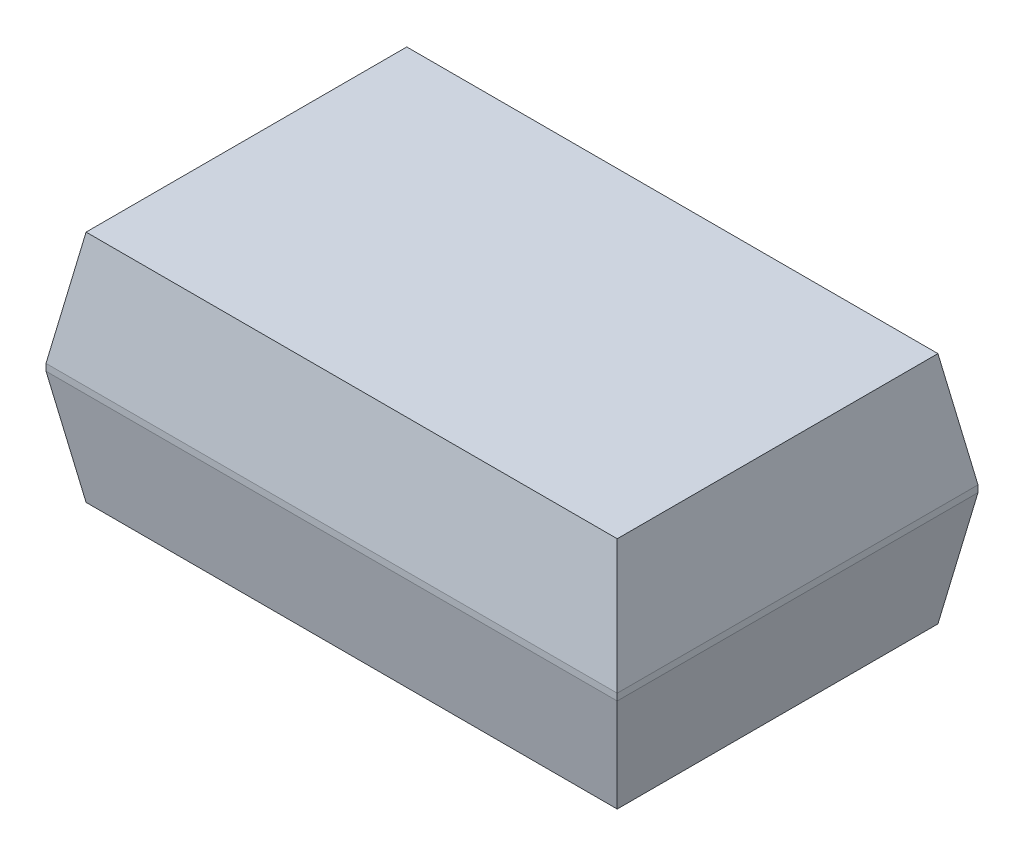
ISO-10303-21;
HEADER;
FILE_DESCRIPTION(('STEP AP214'),'2;1');
FILE_NAME('part.step','',(''),(''),'','','');
FILE_SCHEMA(('AUTOMOTIVE_DESIGN { 1 0 10303 214 1 1 1 1 }'));
ENDSEC;
DATA;
#1=APPLICATION_CONTEXT('core data for automotive mechanical design processes');
#2=APPLICATION_PROTOCOL_DEFINITION('international standard','automotive_design',2000,#1);
#3=PRODUCT_CONTEXT('',#1,'mechanical');
#4=PRODUCT('Part','Part','',(#3));
#5=PRODUCT_RELATED_PRODUCT_CATEGORY('part','',(#4));
#6=PRODUCT_DEFINITION_FORMATION('','',#4);
#7=PRODUCT_DEFINITION_CONTEXT('part definition',#1,'design');
#8=PRODUCT_DEFINITION('design','',#6,#7);
#9=PRODUCT_DEFINITION_SHAPE('','',#8);
#10=(LENGTH_UNIT() NAMED_UNIT(*) SI_UNIT(.MILLI.,.METRE.));
#11=(NAMED_UNIT(*) PLANE_ANGLE_UNIT() SI_UNIT($,.RADIAN.));
#12=(NAMED_UNIT(*) SI_UNIT($,.STERADIAN.) SOLID_ANGLE_UNIT());
#13=UNCERTAINTY_MEASURE_WITH_UNIT(LENGTH_MEASURE(1.E-05),#10,'distance_accuracy_value','');
#14=(GEOMETRIC_REPRESENTATION_CONTEXT(3) GLOBAL_UNCERTAINTY_ASSIGNED_CONTEXT((#13)) GLOBAL_UNIT_ASSIGNED_CONTEXT((#10,
#11,#12)) REPRESENTATION_CONTEXT('',''));
#15=CARTESIAN_POINT('',(0.,0.,0.));
#16=DIRECTION('',(0.,0.,1.));
#17=DIRECTION('',(1.,0.,0.));
#18=AXIS2_PLACEMENT_3D('',#15,#16,#17);
#19=CARTESIAN_POINT('',(1.375,0.283564090981,0.45));
#20=DIRECTION('',(0.98480775301219,-0.173648177667033,0.));
#21=DIRECTION('',(0.173648177667033,0.98480775301219,0.));
#22=AXIS2_PLACEMENT_3D('',#19,#20,#21);
#23=PLANE('',#22);
#24=DIRECTION('',(0.,0.,1.));
#25=VECTOR('',#24,1.);
#26=CARTESIAN_POINT('',(1.32499999999995,0.,0.45));
#27=LINE('',#26,#25);
#28=CARTESIAN_POINT('',(1.32499999999998,0.,0.799999999999988));
#29=VERTEX_POINT('',#28);
#30=CARTESIAN_POINT('',(1.32499999999998,0.,-0.799999999999988));
#31=VERTEX_POINT('',#30);
#32=EDGE_CURVE('E85',#29,#31,#27,.F.);
#33=ORIENTED_EDGE('',*,*,#32,.T.);
#34=DIRECTION('',(0.171087869746139,0.970287525247807,-0.171087869745971));
#35=VECTOR('',#34,1.);
#36=CARTESIAN_POINT('',(1.32499999999995,0.,-0.8));
#37=LINE('',#36,#35);
#38=CARTESIAN_POINT('',(1.42500000000002,0.567128181961995,-0.900000000000006));
#39=VERTEX_POINT('',#38);
#40=EDGE_CURVE('E80',#31,#39,#37,.T.);
#41=ORIENTED_EDGE('',*,*,#40,.T.);
#42=DIRECTION('',(0.,0.,-1.));
#43=VECTOR('',#42,1.);
#44=CARTESIAN_POINT('',(1.425,0.567128181962,0.9));
#45=LINE('',#44,#43);
#46=CARTESIAN_POINT('',(1.42500000000002,0.567128181961995,0.900000000000006));
#47=VERTEX_POINT('',#46);
#48=EDGE_CURVE('E99',#47,#39,#45,.T.);
#49=ORIENTED_EDGE('',*,*,#48,.F.);
#50=DIRECTION('',(-0.171087869746139,-0.970287525247807,-0.171087869745971));
#51=VECTOR('',#50,1.);
#52=CARTESIAN_POINT('',(1.42500000000005,0.567128181961991,0.9));
#53=LINE('',#52,#51);
#54=EDGE_CURVE('E20',#47,#29,#53,.T.);
#55=ORIENTED_EDGE('',*,*,#54,.T.);
#56=EDGE_LOOP('',(#33,#41,#49,#55));
#57=FACE_BOUND('',#56,.T.);
#58=ADVANCED_FACE('F17',(#57),#23,.T.);
#59=CARTESIAN_POINT('',(-1.375,0.283564090981,-0.45));
#60=DIRECTION('',(-0.98480775301219,-0.173648177667033,0.));
#61=DIRECTION('',(0.173648177667033,-0.98480775301219,0.));
#62=AXIS2_PLACEMENT_3D('',#59,#60,#61);
#63=PLANE('',#62);
#64=DIRECTION('',(0.,0.,1.));
#65=VECTOR('',#64,1.);
#66=CARTESIAN_POINT('',(-1.425,0.567128181962,-0.9));
#67=LINE('',#66,#65);
#68=CARTESIAN_POINT('',(-1.42500000000002,0.567128181961995,-0.900000000000006));
#69=VERTEX_POINT('',#68);
#70=CARTESIAN_POINT('',(-1.42500000000002,0.567128181961995,0.900000000000006));
#71=VERTEX_POINT('',#70);
#72=EDGE_CURVE('E122',#69,#71,#67,.T.);
#73=ORIENTED_EDGE('',*,*,#72,.F.);
#74=DIRECTION('',(0.171087869746139,-0.970287525247807,0.171087869745971));
#75=VECTOR('',#74,1.);
#76=CARTESIAN_POINT('',(-1.42500000000005,0.567128181961991,-0.9));
#77=LINE('',#76,#75);
#78=CARTESIAN_POINT('',(-1.32499999999998,0.,-0.799999999999988));
#79=VERTEX_POINT('',#78);
#80=EDGE_CURVE('E105',#69,#79,#77,.T.);
#81=ORIENTED_EDGE('',*,*,#80,.T.);
#82=DIRECTION('',(0.,0.,1.));
#83=VECTOR('',#82,1.);
#84=CARTESIAN_POINT('',(-1.32499999999995,0.,-0.45));
#85=LINE('',#84,#83);
#86=CARTESIAN_POINT('',(-1.32499999999998,0.,0.799999999999988));
#87=VERTEX_POINT('',#86);
#88=EDGE_CURVE('E131',#79,#87,#85,.T.);
#89=ORIENTED_EDGE('',*,*,#88,.T.);
#90=DIRECTION('',(-0.171087869746139,0.970287525247807,0.17108786974597));
#91=VECTOR('',#90,1.);
#92=CARTESIAN_POINT('',(-1.32499999999995,0.,0.8));
#93=LINE('',#92,#91);
#94=EDGE_CURVE('E95',#87,#71,#93,.T.);
#95=ORIENTED_EDGE('',*,*,#94,.T.);
#96=EDGE_LOOP('',(#73,#81,#89,#95));
#97=FACE_BOUND('',#96,.T.);
#98=ADVANCED_FACE('F135',(#97),#63,.T.);
#99=CARTESIAN_POINT('',(1.425,0.,0.9));
#100=DIRECTION('',(1.,0.,0.));
#101=DIRECTION('',(0.,0.,-1.));
#102=AXIS2_PLACEMENT_3D('',#99,#100,#101);
#103=PLANE('',#102);
#104=DIRECTION('',(0.,0.,1.));
#105=VECTOR('',#104,1.);
#106=CARTESIAN_POINT('',(1.42500000000005,0.600871818038009,0.45));
#107=LINE('',#106,#105);
#108=CARTESIAN_POINT('',(1.42500000000001,0.600871818038004,0.900000000000012));
#109=VERTEX_POINT('',#108);
#110=CARTESIAN_POINT('',(1.42500000000001,0.600871818038003,-0.900000000000006));
#111=VERTEX_POINT('',#110);
#112=EDGE_CURVE('E120',#109,#111,#107,.F.);
#113=ORIENTED_EDGE('',*,*,#112,.F.);
#114=DIRECTION('',(0.,1.,0.));
#115=VECTOR('',#114,1.);
#116=CARTESIAN_POINT('',(1.425,0.,0.9));
#117=LINE('',#116,#115);
#118=EDGE_CURVE('E112',#109,#47,#117,.F.);
#119=ORIENTED_EDGE('',*,*,#118,.T.);
#120=ORIENTED_EDGE('',*,*,#48,.T.);
#121=DIRECTION('',(0.,1.,0.));
#122=VECTOR('',#121,1.);
#123=CARTESIAN_POINT('',(1.425,0.,-0.9));
#124=LINE('',#123,#122);
#125=EDGE_CURVE('E104',#39,#111,#124,.T.);
#126=ORIENTED_EDGE('',*,*,#125,.T.);
#127=EDGE_LOOP('',(#113,#119,#120,#126));
#128=FACE_BOUND('',#127,.T.);
#129=ADVANCED_FACE('F119',(#128),#103,.T.);
#130=CARTESIAN_POINT('',(-1.425,0.,-0.9));
#131=DIRECTION('',(-1.,0.,0.));
#132=DIRECTION('',(0.,0.,1.));
#133=AXIS2_PLACEMENT_3D('',#130,#131,#132);
#134=PLANE('',#133);
#135=DIRECTION('',(0.,0.,1.));
#136=VECTOR('',#135,1.);
#137=CARTESIAN_POINT('',(-1.42500000000005,0.600871818038009,-0.45));
#138=LINE('',#137,#136);
#139=CARTESIAN_POINT('',(-1.42500000000001,0.600871818038003,-0.900000000000006));
#140=VERTEX_POINT('',#139);
#141=CARTESIAN_POINT('',(-1.42500000000001,0.600871818038003,0.900000000000006));
#142=VERTEX_POINT('',#141);
#143=EDGE_CURVE('E148',#140,#142,#138,.T.);
#144=ORIENTED_EDGE('',*,*,#143,.F.);
#145=DIRECTION('',(0.,1.,0.));
#146=VECTOR('',#145,1.);
#147=CARTESIAN_POINT('',(-1.425,0.,-0.9));
#148=LINE('',#147,#146);
#149=EDGE_CURVE('E143',#140,#69,#148,.F.);
#150=ORIENTED_EDGE('',*,*,#149,.T.);
#151=ORIENTED_EDGE('',*,*,#72,.T.);
#152=DIRECTION('',(0.,1.,0.));
#153=VECTOR('',#152,1.);
#154=CARTESIAN_POINT('',(-1.425,0.,0.9));
#155=LINE('',#154,#153);
#156=EDGE_CURVE('E114',#71,#142,#155,.T.);
#157=ORIENTED_EDGE('',*,*,#156,.T.);
#158=EDGE_LOOP('',(#144,#150,#151,#157));
#159=FACE_BOUND('',#158,.T.);
#160=ADVANCED_FACE('F146',(#159),#134,.T.);
#161=CARTESIAN_POINT('',(1.375,0.884435909019,0.45));
#162=DIRECTION('',(0.98480775301219,0.173648177667033,0.));
#163=DIRECTION('',(-0.173648177667033,0.98480775301219,0.));
#164=AXIS2_PLACEMENT_3D('',#161,#162,#163);
#165=PLANE('',#164);
#166=ORIENTED_EDGE('',*,*,#112,.T.);
#167=DIRECTION('',(-0.171087869746139,0.970287525247807,0.17108786974597));
#168=VECTOR('',#167,1.);
#169=CARTESIAN_POINT('',(1.42500000000005,0.600871818038009,-0.9));
#170=LINE('',#169,#168);
#171=CARTESIAN_POINT('',(1.32499999999998,1.16799999999999,-0.799999999999988));
#172=VERTEX_POINT('',#171);
#173=EDGE_CURVE('E35',#111,#172,#170,.T.);
#174=ORIENTED_EDGE('',*,*,#173,.T.);
#175=DIRECTION('',(0.,0.,-1.));
#176=VECTOR('',#175,1.);
#177=CARTESIAN_POINT('',(1.325,1.168,0.));
#178=LINE('',#177,#176);
#179=CARTESIAN_POINT('',(1.32499999999998,1.16799999999999,0.799999999999988));
#180=VERTEX_POINT('',#179);
#181=EDGE_CURVE('E162',#172,#180,#178,.F.);
#182=ORIENTED_EDGE('',*,*,#181,.T.);
#183=DIRECTION('',(0.171087869746139,-0.970287525247807,0.171087869745971));
#184=VECTOR('',#183,1.);
#185=CARTESIAN_POINT('',(1.32499999999995,1.16799999999999,0.8));
#186=LINE('',#185,#184);
#187=EDGE_CURVE('E150',#180,#109,#186,.T.);
#188=ORIENTED_EDGE('',*,*,#187,.T.);
#189=EDGE_LOOP('',(#166,#174,#182,#188));
#190=FACE_BOUND('',#189,.T.);
#191=ADVANCED_FACE('F176',(#190),#165,.T.);
#192=CARTESIAN_POINT('',(-1.375,0.884435909019,-0.45));
#193=DIRECTION('',(-0.98480775301219,0.173648177667033,0.));
#194=DIRECTION('',(-0.173648177667033,-0.98480775301219,0.));
#195=AXIS2_PLACEMENT_3D('',#192,#193,#194);
#196=PLANE('',#195);
#197=DIRECTION('',(0.,0.,-1.));
#198=VECTOR('',#197,1.);
#199=CARTESIAN_POINT('',(-1.325,1.168,0.));
#200=LINE('',#199,#198);
#201=CARTESIAN_POINT('',(-1.32499999999998,1.16799999999999,0.799999999999988));
#202=VERTEX_POINT('',#201);
#203=CARTESIAN_POINT('',(-1.32499999999998,1.16799999999999,-0.799999999999988));
#204=VERTEX_POINT('',#203);
#205=EDGE_CURVE('E164',#202,#204,#200,.T.);
#206=ORIENTED_EDGE('',*,*,#205,.T.);
#207=DIRECTION('',(-0.171087869746139,-0.970287525247807,-0.171087869745971));
#208=VECTOR('',#207,1.);
#209=CARTESIAN_POINT('',(-1.32499999999995,1.16799999999999,-0.8));
#210=LINE('',#209,#208);
#211=EDGE_CURVE('E159',#204,#140,#210,.T.);
#212=ORIENTED_EDGE('',*,*,#211,.T.);
#213=ORIENTED_EDGE('',*,*,#143,.T.);
#214=DIRECTION('',(0.171087869746139,0.970287525247807,-0.17108786974597));
#215=VECTOR('',#214,1.);
#216=CARTESIAN_POINT('',(-1.42500000000005,0.600871818038009,0.9));
#217=LINE('',#216,#215);
#218=EDGE_CURVE('E157',#142,#202,#217,.T.);
#219=ORIENTED_EDGE('',*,*,#218,.T.);
#220=EDGE_LOOP('',(#206,#212,#213,#219));
#221=FACE_BOUND('',#220,.T.);
#222=ADVANCED_FACE('F182',(#221),#196,.T.);
#223=CARTESIAN_POINT('',(0.,1.168,0.));
#224=DIRECTION('',(0.,-1.,0.));
#225=DIRECTION('',(0.,0.,-1.));
#226=AXIS2_PLACEMENT_3D('',#223,#224,#225);
#227=PLANE('',#226);
#228=ORIENTED_EDGE('',*,*,#205,.F.);
#229=DIRECTION('',(1.,0.,0.));
#230=VECTOR('',#229,1.);
#231=CARTESIAN_POINT('',(-0.7125,1.16799999999999,0.799999999999951));
#232=LINE('',#231,#230);
#233=EDGE_CURVE('E167',#180,#202,#232,.F.);
#234=ORIENTED_EDGE('',*,*,#233,.F.);
#235=ORIENTED_EDGE('',*,*,#181,.F.);
#236=DIRECTION('',(1.,0.,0.));
#237=VECTOR('',#236,1.);
#238=CARTESIAN_POINT('',(0.7125,1.16799999999999,-0.799999999999951));
#239=LINE('',#238,#237);
#240=EDGE_CURVE('E170',#204,#172,#239,.T.);
#241=ORIENTED_EDGE('',*,*,#240,.F.);
#242=EDGE_LOOP('',(#228,#234,#235,#241));
#243=FACE_BOUND('',#242,.T.);
#244=ADVANCED_FACE('F187',(#243),#227,.F.);
#245=CARTESIAN_POINT('',(-0.7125,0.884435909019,0.85));
#246=DIRECTION('',(0.,0.173648177667033,0.98480775301219));
#247=DIRECTION('',(0.,-0.98480775301219,0.173648177667033));
#248=AXIS2_PLACEMENT_3D('',#245,#246,#247);
#249=PLANE('',#248);
#250=DIRECTION('',(1.,0.,0.));
#251=VECTOR('',#250,1.);
#252=CARTESIAN_POINT('',(-1.425,0.600871818038,0.9));
#253=LINE('',#252,#251);
#254=EDGE_CURVE('E173',#109,#142,#253,.F.);
#255=ORIENTED_EDGE('',*,*,#254,.F.);
#256=ORIENTED_EDGE('',*,*,#187,.F.);
#257=ORIENTED_EDGE('',*,*,#233,.T.);
#258=ORIENTED_EDGE('',*,*,#218,.F.);
#259=EDGE_LOOP('',(#255,#256,#257,#258));
#260=FACE_BOUND('',#259,.T.);
#261=ADVANCED_FACE('F179',(#260),#249,.T.);
#262=CARTESIAN_POINT('',(0.7125,0.884435909019,-0.85));
#263=DIRECTION('',(0.,0.173648177667033,-0.98480775301219));
#264=DIRECTION('',(0.,0.98480775301219,0.173648177667033));
#265=AXIS2_PLACEMENT_3D('',#262,#263,#264);
#266=PLANE('',#265);
#267=DIRECTION('',(-1.,0.,0.));
#268=VECTOR('',#267,1.);
#269=CARTESIAN_POINT('',(1.425,0.600871818038,-0.9));
#270=LINE('',#269,#268);
#271=EDGE_CURVE('E116',#140,#111,#270,.F.);
#272=ORIENTED_EDGE('',*,*,#271,.F.);
#273=ORIENTED_EDGE('',*,*,#211,.F.);
#274=ORIENTED_EDGE('',*,*,#240,.T.);
#275=ORIENTED_EDGE('',*,*,#173,.F.);
#276=EDGE_LOOP('',(#272,#273,#274,#275));
#277=FACE_BOUND('',#276,.T.);
#278=ADVANCED_FACE('F185',(#277),#266,.T.);
#279=CARTESIAN_POINT('',(-1.425,0.,0.9));
#280=DIRECTION('',(0.,0.,1.));
#281=DIRECTION('',(1.,0.,0.));
#282=AXIS2_PLACEMENT_3D('',#279,#280,#281);
#283=PLANE('',#282);
#284=ORIENTED_EDGE('',*,*,#254,.T.);
#285=ORIENTED_EDGE('',*,*,#156,.F.);
#286=DIRECTION('',(1.,0.,0.));
#287=VECTOR('',#286,1.);
#288=CARTESIAN_POINT('',(-0.7125,0.567128181961991,0.900000000000049));
#289=LINE('',#288,#287);
#290=EDGE_CURVE('E109',#47,#71,#289,.F.);
#291=ORIENTED_EDGE('',*,*,#290,.F.);
#292=ORIENTED_EDGE('',*,*,#118,.F.);
#293=EDGE_LOOP('',(#284,#285,#291,#292));
#294=FACE_BOUND('',#293,.T.);
#295=ADVANCED_FACE('F111',(#294),#283,.T.);
#296=CARTESIAN_POINT('',(1.425,0.,-0.9));
#297=DIRECTION('',(0.,0.,-1.));
#298=DIRECTION('',(-1.,0.,0.));
#299=AXIS2_PLACEMENT_3D('',#296,#297,#298);
#300=PLANE('',#299);
#301=ORIENTED_EDGE('',*,*,#271,.T.);
#302=ORIENTED_EDGE('',*,*,#125,.F.);
#303=DIRECTION('',(1.,0.,0.));
#304=VECTOR('',#303,1.);
#305=CARTESIAN_POINT('',(0.7125,0.567128181961991,-0.900000000000049));
#306=LINE('',#305,#304);
#307=EDGE_CURVE('E96',#69,#39,#306,.T.);
#308=ORIENTED_EDGE('',*,*,#307,.F.);
#309=ORIENTED_EDGE('',*,*,#149,.F.);
#310=EDGE_LOOP('',(#301,#302,#308,#309));
#311=FACE_BOUND('',#310,.T.);
#312=ADVANCED_FACE('F142',(#311),#300,.T.);
#313=CARTESIAN_POINT('',(-0.7125,0.283564090981,0.85));
#314=DIRECTION('',(0.,-0.173648177667033,0.98480775301219));
#315=DIRECTION('',(0.,-0.98480775301219,-0.173648177667033));
#316=AXIS2_PLACEMENT_3D('',#313,#314,#315);
#317=PLANE('',#316);
#318=ORIENTED_EDGE('',*,*,#290,.T.);
#319=ORIENTED_EDGE('',*,*,#94,.F.);
#320=DIRECTION('',(1.,0.,0.));
#321=VECTOR('',#320,1.);
#322=CARTESIAN_POINT('',(0.,0.,0.8));
#323=LINE('',#322,#321);
#324=EDGE_CURVE('E26',#29,#87,#323,.F.);
#325=ORIENTED_EDGE('',*,*,#324,.F.);
#326=ORIENTED_EDGE('',*,*,#54,.F.);
#327=EDGE_LOOP('',(#318,#319,#325,#326));
#328=FACE_BOUND('',#327,.T.);
#329=ADVANCED_FACE('F93',(#328),#317,.T.);
#330=CARTESIAN_POINT('',(0.7125,0.283564090981,-0.85));
#331=DIRECTION('',(0.,-0.173648177667033,-0.98480775301219));
#332=DIRECTION('',(0.,0.98480775301219,-0.173648177667033));
#333=AXIS2_PLACEMENT_3D('',#330,#331,#332);
#334=PLANE('',#333);
#335=ORIENTED_EDGE('',*,*,#307,.T.);
#336=ORIENTED_EDGE('',*,*,#40,.F.);
#337=DIRECTION('',(1.,0.,0.));
#338=VECTOR('',#337,1.);
#339=CARTESIAN_POINT('',(0.,0.,-0.8));
#340=LINE('',#339,#338);
#341=EDGE_CURVE('E11',#79,#31,#340,.T.);
#342=ORIENTED_EDGE('',*,*,#341,.F.);
#343=ORIENTED_EDGE('',*,*,#80,.F.);
#344=EDGE_LOOP('',(#335,#336,#342,#343));
#345=FACE_BOUND('',#344,.T.);
#346=ADVANCED_FACE('F136',(#345),#334,.T.);
#347=CARTESIAN_POINT('',(0.,0.,0.));
#348=DIRECTION('',(0.,-1.,0.));
#349=DIRECTION('',(0.,0.,-1.));
#350=AXIS2_PLACEMENT_3D('',#347,#348,#349);
#351=PLANE('',#350);
#352=ORIENTED_EDGE('',*,*,#341,.T.);
#353=ORIENTED_EDGE('',*,*,#32,.F.);
#354=ORIENTED_EDGE('',*,*,#324,.T.);
#355=ORIENTED_EDGE('',*,*,#88,.F.);
#356=EDGE_LOOP('',(#352,#353,#354,#355));
#357=FACE_BOUND('',#356,.T.);
#358=ADVANCED_FACE('F87',(#357),#351,.T.);
#359=CLOSED_SHELL('',(#58,#98,#129,#160,#191,#222,#244,#261,#278,#295,#312,#329,#346,#358));
#360=MANIFOLD_SOLID_BREP('B1',#359);
#361=ADVANCED_BREP_SHAPE_REPRESENTATION('',(#18,#360),#14);
#362=SHAPE_DEFINITION_REPRESENTATION(#9,#361);
ENDSEC;
END-ISO-10303-21;
